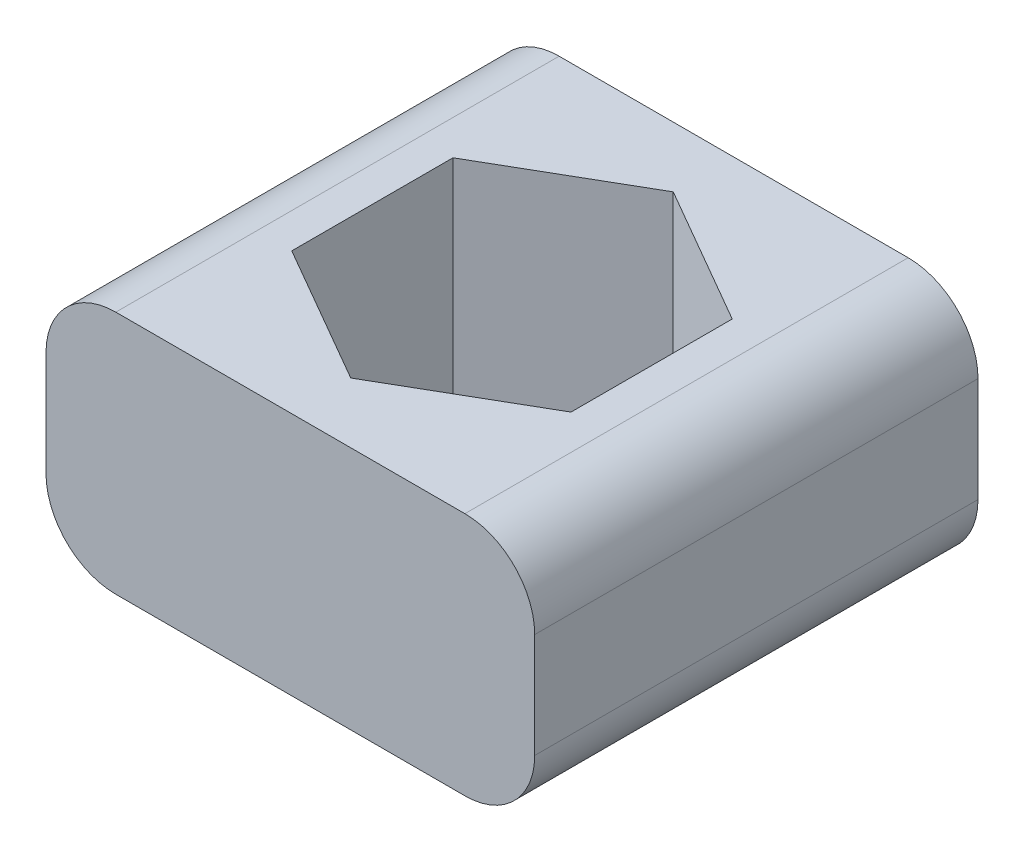
ISO-10303-21;
HEADER;
FILE_DESCRIPTION(('STEP AP214'),'2;1');
FILE_NAME('part.step','',(''),(''),'','','');
FILE_SCHEMA(('AUTOMOTIVE_DESIGN { 1 0 10303 214 1 1 1 1 }'));
ENDSEC;
DATA;
#1=APPLICATION_CONTEXT('core data for automotive mechanical design processes');
#2=APPLICATION_PROTOCOL_DEFINITION('international standard','automotive_design',2000,#1);
#3=PRODUCT_CONTEXT('',#1,'mechanical');
#4=PRODUCT('Part','Part','',(#3));
#5=PRODUCT_RELATED_PRODUCT_CATEGORY('part','',(#4));
#6=PRODUCT_DEFINITION_FORMATION('','',#4);
#7=PRODUCT_DEFINITION_CONTEXT('part definition',#1,'design');
#8=PRODUCT_DEFINITION('design','',#6,#7);
#9=PRODUCT_DEFINITION_SHAPE('','',#8);
#10=(LENGTH_UNIT() NAMED_UNIT(*) SI_UNIT(.MILLI.,.METRE.));
#11=(NAMED_UNIT(*) PLANE_ANGLE_UNIT() SI_UNIT($,.RADIAN.));
#12=(NAMED_UNIT(*) SI_UNIT($,.STERADIAN.) SOLID_ANGLE_UNIT());
#13=UNCERTAINTY_MEASURE_WITH_UNIT(LENGTH_MEASURE(1.E-05),#10,'distance_accuracy_value','');
#14=(GEOMETRIC_REPRESENTATION_CONTEXT(3) GLOBAL_UNCERTAINTY_ASSIGNED_CONTEXT((#13)) GLOBAL_UNIT_ASSIGNED_CONTEXT((#10,
#11,#12)) REPRESENTATION_CONTEXT('',''));
#15=CARTESIAN_POINT('',(0.,0.,0.));
#16=DIRECTION('',(0.,0.,1.));
#17=DIRECTION('',(1.,0.,0.));
#18=AXIS2_PLACEMENT_3D('',#15,#16,#17);
#19=CARTESIAN_POINT('',(7.,-7.,6.35));
#20=DIRECTION('',(-1.,0.,0.));
#21=DIRECTION('',(0.,-1.,0.));
#22=AXIS2_PLACEMENT_3D('',#19,#20,#21);
#23=PLANE('',#22);
#24=DIRECTION('',(0.,1.,0.));
#25=VECTOR('',#24,1.);
#26=CARTESIAN_POINT('',(7.,-7.,-6.35));
#27=LINE('',#26,#25);
#28=CARTESIAN_POINT('',(7.,-5.,-6.35));
#29=VERTEX_POINT('',#28);
#30=CARTESIAN_POINT('',(7.,-2.,-6.35));
#31=VERTEX_POINT('',#30);
#32=EDGE_CURVE('E213',#29,#31,#27,.T.);
#33=ORIENTED_EDGE('',*,*,#32,.T.);
#34=DIRECTION('',(0.,0.,-1.));
#35=VECTOR('',#34,1.);
#36=CARTESIAN_POINT('',(7.,-2.,6.35));
#37=LINE('',#36,#35);
#38=CARTESIAN_POINT('',(7.,-2.,6.35));
#39=VERTEX_POINT('',#38);
#40=EDGE_CURVE('E276',#31,#39,#37,.F.);
#41=ORIENTED_EDGE('',*,*,#40,.T.);
#42=DIRECTION('',(0.,1.,0.));
#43=VECTOR('',#42,1.);
#44=CARTESIAN_POINT('',(7.,-7.,6.35));
#45=LINE('',#44,#43);
#46=CARTESIAN_POINT('',(7.,-5.,6.35));
#47=VERTEX_POINT('',#46);
#48=EDGE_CURVE('E225',#47,#39,#45,.T.);
#49=ORIENTED_EDGE('',*,*,#48,.F.);
#50=DIRECTION('',(0.,0.,-1.));
#51=VECTOR('',#50,1.);
#52=CARTESIAN_POINT('',(7.,-5.,6.35));
#53=LINE('',#52,#51);
#54=EDGE_CURVE('E272',#47,#29,#53,.T.);
#55=ORIENTED_EDGE('',*,*,#54,.T.);
#56=EDGE_LOOP('',(#33,#41,#49,#55));
#57=FACE_BOUND('',#56,.T.);
#58=ADVANCED_FACE('F42',(#57),#23,.F.);
#59=CARTESIAN_POINT('',(-7.,0.,6.35));
#60=DIRECTION('',(0.,-1.,0.));
#61=DIRECTION('',(0.,0.,-1.));
#62=AXIS2_PLACEMENT_3D('',#59,#60,#61);
#63=PLANE('',#62);
#64=DIRECTION('',(0.866025403784439,0.,-0.499999999999999));
#65=VECTOR('',#64,1.);
#66=CARTESIAN_POINT('',(0.,0.,4.61880215351701));
#67=LINE('',#66,#65);
#68=CARTESIAN_POINT('',(0.,0.,4.61880215351701));
#69=VERTEX_POINT('',#68);
#70=CARTESIAN_POINT('',(4.,0.,2.30940107675851));
#71=VERTEX_POINT('',#70);
#72=EDGE_CURVE('E196',#69,#71,#67,.T.);
#73=ORIENTED_EDGE('',*,*,#72,.F.);
#74=DIRECTION('',(0.866025403784438,0.,0.5));
#75=VECTOR('',#74,1.);
#76=CARTESIAN_POINT('',(-4.,0.,2.3094010767585));
#77=LINE('',#76,#75);
#78=CARTESIAN_POINT('',(-4.,0.,2.3094010767585));
#79=VERTEX_POINT('',#78);
#80=EDGE_CURVE('E153',#79,#69,#77,.T.);
#81=ORIENTED_EDGE('',*,*,#80,.F.);
#82=DIRECTION('',(0.,0.,1.));
#83=VECTOR('',#82,1.);
#84=CARTESIAN_POINT('',(-4.,0.,-2.30940107675851));
#85=LINE('',#84,#83);
#86=CARTESIAN_POINT('',(-4.,0.,-2.30940107675851));
#87=VERTEX_POINT('',#86);
#88=EDGE_CURVE('E174',#87,#79,#85,.T.);
#89=ORIENTED_EDGE('',*,*,#88,.F.);
#90=DIRECTION('',(-0.866025403784439,0.,0.5));
#91=VECTOR('',#90,1.);
#92=CARTESIAN_POINT('',(0.,0.,-4.61880215351701));
#93=LINE('',#92,#91);
#94=CARTESIAN_POINT('',(0.,0.,-4.61880215351701));
#95=VERTEX_POINT('',#94);
#96=EDGE_CURVE('E178',#95,#87,#93,.T.);
#97=ORIENTED_EDGE('',*,*,#96,.F.);
#98=DIRECTION('',(-0.866025403784438,0.,-0.500000000000001));
#99=VECTOR('',#98,1.);
#100=CARTESIAN_POINT('',(4.,0.,-2.3094010767585));
#101=LINE('',#100,#99);
#102=CARTESIAN_POINT('',(4.,0.,-2.3094010767585));
#103=VERTEX_POINT('',#102);
#104=EDGE_CURVE('E203',#103,#95,#101,.T.);
#105=ORIENTED_EDGE('',*,*,#104,.F.);
#106=DIRECTION('',(0.,0.,-1.));
#107=VECTOR('',#106,1.);
#108=CARTESIAN_POINT('',(4.,0.,2.30940107675851));
#109=LINE('',#108,#107);
#110=EDGE_CURVE('E199',#71,#103,#109,.T.);
#111=ORIENTED_EDGE('',*,*,#110,.F.);
#112=EDGE_LOOP('',(#73,#81,#89,#97,#105,#111));
#113=FACE_BOUND('',#112,.T.);
#114=DIRECTION('',(-1.,0.,0.));
#115=VECTOR('',#114,1.);
#116=CARTESIAN_POINT('',(-7.,0.,6.35));
#117=LINE('',#116,#115);
#118=CARTESIAN_POINT('',(5.,0.,6.35));
#119=VERTEX_POINT('',#118);
#120=CARTESIAN_POINT('',(-5.,0.,6.35));
#121=VERTEX_POINT('',#120);
#122=EDGE_CURVE('E229',#119,#121,#117,.T.);
#123=ORIENTED_EDGE('',*,*,#122,.F.);
#124=DIRECTION('',(0.,0.,-1.));
#125=VECTOR('',#124,1.);
#126=CARTESIAN_POINT('',(5.,0.,6.35));
#127=LINE('',#126,#125);
#128=CARTESIAN_POINT('',(5.,0.,-6.35));
#129=VERTEX_POINT('',#128);
#130=EDGE_CURVE('E256',#119,#129,#127,.T.);
#131=ORIENTED_EDGE('',*,*,#130,.T.);
#132=DIRECTION('',(-1.,0.,0.));
#133=VECTOR('',#132,1.);
#134=CARTESIAN_POINT('',(-7.,0.,-6.35));
#135=LINE('',#134,#133);
#136=CARTESIAN_POINT('',(-5.,0.,-6.35));
#137=VERTEX_POINT('',#136);
#138=EDGE_CURVE('E244',#129,#137,#135,.T.);
#139=ORIENTED_EDGE('',*,*,#138,.T.);
#140=DIRECTION('',(0.,0.,-1.));
#141=VECTOR('',#140,1.);
#142=CARTESIAN_POINT('',(-5.,0.,6.35));
#143=LINE('',#142,#141);
#144=EDGE_CURVE('E240',#137,#121,#143,.F.);
#145=ORIENTED_EDGE('',*,*,#144,.T.);
#146=EDGE_LOOP('',(#123,#131,#139,#145));
#147=FACE_BOUND('',#146,.T.);
#148=ADVANCED_FACE('F329',(#113,#147),#63,.F.);
#149=CARTESIAN_POINT('',(-7.,0.,6.35));
#150=DIRECTION('',(1.,0.,0.));
#151=DIRECTION('',(0.,1.,0.));
#152=AXIS2_PLACEMENT_3D('',#149,#150,#151);
#153=PLANE('',#152);
#154=DIRECTION('',(0.,-1.,0.));
#155=VECTOR('',#154,1.);
#156=CARTESIAN_POINT('',(-7.,0.,-6.35));
#157=LINE('',#156,#155);
#158=CARTESIAN_POINT('',(-7.,-2.,-6.35));
#159=VERTEX_POINT('',#158);
#160=CARTESIAN_POINT('',(-7.,-5.,-6.35));
#161=VERTEX_POINT('',#160);
#162=EDGE_CURVE('E248',#159,#161,#157,.T.);
#163=ORIENTED_EDGE('',*,*,#162,.T.);
#164=DIRECTION('',(0.,0.,-1.));
#165=VECTOR('',#164,1.);
#166=CARTESIAN_POINT('',(-7.,-5.,6.35));
#167=LINE('',#166,#165);
#168=CARTESIAN_POINT('',(-7.,-5.,6.35));
#169=VERTEX_POINT('',#168);
#170=EDGE_CURVE('E11',#161,#169,#167,.F.);
#171=ORIENTED_EDGE('',*,*,#170,.T.);
#172=DIRECTION('',(0.,-1.,0.));
#173=VECTOR('',#172,1.);
#174=CARTESIAN_POINT('',(-7.,0.,6.35));
#175=LINE('',#174,#173);
#176=CARTESIAN_POINT('',(-7.,-2.,6.35));
#177=VERTEX_POINT('',#176);
#178=EDGE_CURVE('E234',#177,#169,#175,.T.);
#179=ORIENTED_EDGE('',*,*,#178,.F.);
#180=DIRECTION('',(0.,0.,-1.));
#181=VECTOR('',#180,1.);
#182=CARTESIAN_POINT('',(-7.,-2.,6.35));
#183=LINE('',#182,#181);
#184=EDGE_CURVE('E52',#177,#159,#183,.T.);
#185=ORIENTED_EDGE('',*,*,#184,.T.);
#186=EDGE_LOOP('',(#163,#171,#179,#185));
#187=FACE_BOUND('',#186,.T.);
#188=ADVANCED_FACE('F302',(#187),#153,.F.);
#189=CARTESIAN_POINT('',(-7.,-7.,6.35));
#190=DIRECTION('',(0.,1.,0.));
#191=DIRECTION('',(0.,0.,1.));
#192=AXIS2_PLACEMENT_3D('',#189,#190,#191);
#193=PLANE('',#192);
#194=CARTESIAN_POINT('',(0.,-7.,0.));
#195=DIRECTION('',(0.,-1.,0.));
#196=DIRECTION('',(0.,0.,-1.));
#197=AXIS2_PLACEMENT_3D('',#194,#195,#196);
#198=CIRCLE('',#197,2.65);
#199=CARTESIAN_POINT('',(0.,-7.,-2.65));
#200=VERTEX_POINT('',#199);
#201=EDGE_CURVE('E181',#200,#200,#198,.T.);
#202=ORIENTED_EDGE('',*,*,#201,.F.);
#203=EDGE_LOOP('',(#202));
#204=FACE_BOUND('',#203,.T.);
#205=DIRECTION('',(1.,0.,0.));
#206=VECTOR('',#205,1.);
#207=CARTESIAN_POINT('',(-7.,-7.,-6.35));
#208=LINE('',#207,#206);
#209=CARTESIAN_POINT('',(-5.,-7.,-6.35));
#210=VERTEX_POINT('',#209);
#211=CARTESIAN_POINT('',(5.,-7.,-6.35));
#212=VERTEX_POINT('',#211);
#213=EDGE_CURVE('E230',#210,#212,#208,.T.);
#214=ORIENTED_EDGE('',*,*,#213,.T.);
#215=DIRECTION('',(0.,0.,-1.));
#216=VECTOR('',#215,1.);
#217=CARTESIAN_POINT('',(5.,-7.,6.35));
#218=LINE('',#217,#216);
#219=CARTESIAN_POINT('',(5.,-7.,6.35));
#220=VERTEX_POINT('',#219);
#221=EDGE_CURVE('E59',#212,#220,#218,.F.);
#222=ORIENTED_EDGE('',*,*,#221,.T.);
#223=DIRECTION('',(1.,0.,0.));
#224=VECTOR('',#223,1.);
#225=CARTESIAN_POINT('',(-7.,-7.,6.35));
#226=LINE('',#225,#224);
#227=CARTESIAN_POINT('',(-5.,-7.,6.35));
#228=VERTEX_POINT('',#227);
#229=EDGE_CURVE('E237',#228,#220,#226,.T.);
#230=ORIENTED_EDGE('',*,*,#229,.F.);
#231=DIRECTION('',(0.,0.,-1.));
#232=VECTOR('',#231,1.);
#233=CARTESIAN_POINT('',(-5.,-7.,6.35));
#234=LINE('',#233,#232);
#235=EDGE_CURVE('E290',#228,#210,#234,.T.);
#236=ORIENTED_EDGE('',*,*,#235,.T.);
#237=EDGE_LOOP('',(#214,#222,#230,#236));
#238=FACE_BOUND('',#237,.T.);
#239=ADVANCED_FACE('F313',(#204,#238),#193,.F.);
#240=CARTESIAN_POINT('',(0.,0.,6.35));
#241=DIRECTION('',(0.,0.,-1.));
#242=DIRECTION('',(-1.,0.,0.));
#243=AXIS2_PLACEMENT_3D('',#240,#241,#242);
#244=PLANE('',#243);
#245=ORIENTED_EDGE('',*,*,#48,.T.);
#246=CARTESIAN_POINT('',(5.,-2.,6.35));
#247=DIRECTION('',(0.,0.,-1.));
#248=DIRECTION('',(-1.,0.,0.));
#249=AXIS2_PLACEMENT_3D('',#246,#247,#248);
#250=CIRCLE('',#249,2.);
#251=EDGE_CURVE('E287',#39,#119,#250,.F.);
#252=ORIENTED_EDGE('',*,*,#251,.T.);
#253=ORIENTED_EDGE('',*,*,#122,.T.);
#254=CARTESIAN_POINT('',(-5.,-2.,6.35));
#255=DIRECTION('',(0.,0.,-1.));
#256=DIRECTION('',(-1.,0.,0.));
#257=AXIS2_PLACEMENT_3D('',#254,#255,#256);
#258=CIRCLE('',#257,2.);
#259=EDGE_CURVE('E279',#121,#177,#258,.F.);
#260=ORIENTED_EDGE('',*,*,#259,.T.);
#261=ORIENTED_EDGE('',*,*,#178,.T.);
#262=CARTESIAN_POINT('',(-5.,-5.,6.35));
#263=DIRECTION('',(0.,0.,-1.));
#264=DIRECTION('',(-1.,0.,0.));
#265=AXIS2_PLACEMENT_3D('',#262,#263,#264);
#266=CIRCLE('',#265,2.);
#267=EDGE_CURVE('E66',#169,#228,#266,.F.);
#268=ORIENTED_EDGE('',*,*,#267,.T.);
#269=ORIENTED_EDGE('',*,*,#229,.T.);
#270=CARTESIAN_POINT('',(5.,-5.,6.35));
#271=DIRECTION('',(0.,0.,-1.));
#272=DIRECTION('',(-1.,0.,0.));
#273=AXIS2_PLACEMENT_3D('',#270,#271,#272);
#274=CIRCLE('',#273,2.);
#275=EDGE_CURVE('E284',#220,#47,#274,.F.);
#276=ORIENTED_EDGE('',*,*,#275,.T.);
#277=EDGE_LOOP('',(#245,#252,#253,#260,#261,#268,#269,#276));
#278=FACE_BOUND('',#277,.T.);
#279=ADVANCED_FACE('F315',(#278),#244,.F.);
#280=CARTESIAN_POINT('',(0.,0.,-6.35));
#281=DIRECTION('',(0.,0.,-1.));
#282=DIRECTION('',(-1.,0.,0.));
#283=AXIS2_PLACEMENT_3D('',#280,#281,#282);
#284=PLANE('',#283);
#285=ORIENTED_EDGE('',*,*,#138,.F.);
#286=CARTESIAN_POINT('',(5.,-2.,-6.35));
#287=DIRECTION('',(0.,0.,-1.));
#288=DIRECTION('',(-1.,0.,0.));
#289=AXIS2_PLACEMENT_3D('',#286,#287,#288);
#290=CIRCLE('',#289,2.);
#291=EDGE_CURVE('E269',#129,#31,#290,.T.);
#292=ORIENTED_EDGE('',*,*,#291,.T.);
#293=ORIENTED_EDGE('',*,*,#32,.F.);
#294=CARTESIAN_POINT('',(5.,-5.,-6.35));
#295=DIRECTION('',(0.,0.,-1.));
#296=DIRECTION('',(-1.,0.,0.));
#297=AXIS2_PLACEMENT_3D('',#294,#295,#296);
#298=CIRCLE('',#297,2.);
#299=EDGE_CURVE('E266',#29,#212,#298,.T.);
#300=ORIENTED_EDGE('',*,*,#299,.T.);
#301=ORIENTED_EDGE('',*,*,#213,.F.);
#302=CARTESIAN_POINT('',(-5.,-5.,-6.35));
#303=DIRECTION('',(0.,0.,-1.));
#304=DIRECTION('',(-1.,0.,0.));
#305=AXIS2_PLACEMENT_3D('',#302,#303,#304);
#306=CIRCLE('',#305,2.);
#307=EDGE_CURVE('E263',#210,#161,#306,.T.);
#308=ORIENTED_EDGE('',*,*,#307,.T.);
#309=ORIENTED_EDGE('',*,*,#162,.F.);
#310=CARTESIAN_POINT('',(-5.,-2.,-6.35));
#311=DIRECTION('',(0.,0.,-1.));
#312=DIRECTION('',(-1.,0.,0.));
#313=AXIS2_PLACEMENT_3D('',#310,#311,#312);
#314=CIRCLE('',#313,2.);
#315=EDGE_CURVE('E260',#159,#137,#314,.T.);
#316=ORIENTED_EDGE('',*,*,#315,.T.);
#317=EDGE_LOOP('',(#285,#292,#293,#300,#301,#308,#309,#316));
#318=FACE_BOUND('',#317,.T.);
#319=ADVANCED_FACE('F308',(#318),#284,.T.);
#320=CARTESIAN_POINT('',(-4.,-6.,2.3094010767585));
#321=DIRECTION('',(-0.5,0.,0.866025403784438));
#322=DIRECTION('',(0.866025403784439,0.,0.5));
#323=AXIS2_PLACEMENT_3D('',#320,#321,#322);
#324=PLANE('',#323);
#325=ORIENTED_EDGE('',*,*,#80,.T.);
#326=DIRECTION('',(0.,1.,0.));
#327=VECTOR('',#326,1.);
#328=CARTESIAN_POINT('',(0.,-6.,4.61880215351701));
#329=LINE('',#328,#327);
#330=CARTESIAN_POINT('',(0.,-6.,4.61880215351701));
#331=VERTEX_POINT('',#330);
#332=EDGE_CURVE('E146',#331,#69,#329,.T.);
#333=ORIENTED_EDGE('',*,*,#332,.F.);
#334=DIRECTION('',(0.866025403784438,0.,0.5));
#335=VECTOR('',#334,1.);
#336=CARTESIAN_POINT('',(-4.,-6.,2.3094010767585));
#337=LINE('',#336,#335);
#338=CARTESIAN_POINT('',(-4.,-6.,2.3094010767585));
#339=VERTEX_POINT('',#338);
#340=EDGE_CURVE('E150',#339,#331,#337,.T.);
#341=ORIENTED_EDGE('',*,*,#340,.F.);
#342=DIRECTION('',(0.,1.,0.));
#343=VECTOR('',#342,1.);
#344=CARTESIAN_POINT('',(-4.,-6.,2.3094010767585));
#345=LINE('',#344,#343);
#346=EDGE_CURVE('E210',#339,#79,#345,.T.);
#347=ORIENTED_EDGE('',*,*,#346,.T.);
#348=EDGE_LOOP('',(#325,#333,#341,#347));
#349=FACE_BOUND('',#348,.T.);
#350=ADVANCED_FACE('F148',(#349),#324,.F.);
#351=CARTESIAN_POINT('',(-4.,-6.,-2.30940107675851));
#352=DIRECTION('',(-1.,0.,0.));
#353=DIRECTION('',(0.,0.,1.));
#354=AXIS2_PLACEMENT_3D('',#351,#352,#353);
#355=PLANE('',#354);
#356=ORIENTED_EDGE('',*,*,#88,.T.);
#357=ORIENTED_EDGE('',*,*,#346,.F.);
#358=DIRECTION('',(0.,0.,1.));
#359=VECTOR('',#358,1.);
#360=CARTESIAN_POINT('',(-4.,-6.,-2.30940107675851));
#361=LINE('',#360,#359);
#362=CARTESIAN_POINT('',(-4.,-6.,-2.30940107675851));
#363=VERTEX_POINT('',#362);
#364=EDGE_CURVE('E159',#363,#339,#361,.T.);
#365=ORIENTED_EDGE('',*,*,#364,.F.);
#366=DIRECTION('',(0.,1.,0.));
#367=VECTOR('',#366,1.);
#368=CARTESIAN_POINT('',(-4.,-6.,-2.30940107675851));
#369=LINE('',#368,#367);
#370=EDGE_CURVE('E214',#363,#87,#369,.T.);
#371=ORIENTED_EDGE('',*,*,#370,.T.);
#372=EDGE_LOOP('',(#356,#357,#365,#371));
#373=FACE_BOUND('',#372,.T.);
#374=ADVANCED_FACE('F442',(#373),#355,.F.);
#375=CARTESIAN_POINT('',(0.,-6.,-4.61880215351701));
#376=DIRECTION('',(-0.5,0.,-0.866025403784439));
#377=DIRECTION('',(-0.866025403784439,0.,0.5));
#378=AXIS2_PLACEMENT_3D('',#375,#376,#377);
#379=PLANE('',#378);
#380=ORIENTED_EDGE('',*,*,#96,.T.);
#381=ORIENTED_EDGE('',*,*,#370,.F.);
#382=DIRECTION('',(-0.866025403784439,0.,0.5));
#383=VECTOR('',#382,1.);
#384=CARTESIAN_POINT('',(0.,-6.,-4.61880215351701));
#385=LINE('',#384,#383);
#386=CARTESIAN_POINT('',(0.,-6.,-4.61880215351701));
#387=VERTEX_POINT('',#386);
#388=EDGE_CURVE('E189',#387,#363,#385,.T.);
#389=ORIENTED_EDGE('',*,*,#388,.F.);
#390=DIRECTION('',(0.,1.,0.));
#391=VECTOR('',#390,1.);
#392=CARTESIAN_POINT('',(0.,-6.,-4.61880215351701));
#393=LINE('',#392,#391);
#394=EDGE_CURVE('E217',#387,#95,#393,.T.);
#395=ORIENTED_EDGE('',*,*,#394,.T.);
#396=EDGE_LOOP('',(#380,#381,#389,#395));
#397=FACE_BOUND('',#396,.T.);
#398=ADVANCED_FACE('F432',(#397),#379,.F.);
#399=CARTESIAN_POINT('',(4.,-6.,-2.3094010767585));
#400=DIRECTION('',(0.500000000000001,0.,-0.866025403784438));
#401=DIRECTION('',(-0.866025403784438,0.,-0.500000000000001));
#402=AXIS2_PLACEMENT_3D('',#399,#400,#401);
#403=PLANE('',#402);
#404=ORIENTED_EDGE('',*,*,#104,.T.);
#405=ORIENTED_EDGE('',*,*,#394,.F.);
#406=DIRECTION('',(-0.866025403784438,0.,-0.500000000000001));
#407=VECTOR('',#406,1.);
#408=CARTESIAN_POINT('',(4.,-6.,-2.3094010767585));
#409=LINE('',#408,#407);
#410=CARTESIAN_POINT('',(4.,-6.,-2.3094010767585));
#411=VERTEX_POINT('',#410);
#412=EDGE_CURVE('E185',#411,#387,#409,.T.);
#413=ORIENTED_EDGE('',*,*,#412,.F.);
#414=DIRECTION('',(0.,1.,0.));
#415=VECTOR('',#414,1.);
#416=CARTESIAN_POINT('',(4.,-6.,-2.3094010767585));
#417=LINE('',#416,#415);
#418=EDGE_CURVE('E220',#411,#103,#417,.T.);
#419=ORIENTED_EDGE('',*,*,#418,.T.);
#420=EDGE_LOOP('',(#404,#405,#413,#419));
#421=FACE_BOUND('',#420,.T.);
#422=ADVANCED_FACE('F422',(#421),#403,.F.);
#423=CARTESIAN_POINT('',(4.,-6.,2.30940107675851));
#424=DIRECTION('',(1.,0.,0.));
#425=DIRECTION('',(0.,0.,-1.));
#426=AXIS2_PLACEMENT_3D('',#423,#424,#425);
#427=PLANE('',#426);
#428=ORIENTED_EDGE('',*,*,#110,.T.);
#429=ORIENTED_EDGE('',*,*,#418,.F.);
#430=DIRECTION('',(0.,0.,-1.));
#431=VECTOR('',#430,1.);
#432=CARTESIAN_POINT('',(4.,-6.,2.30940107675851));
#433=LINE('',#432,#431);
#434=CARTESIAN_POINT('',(4.,-6.,2.30940107675851));
#435=VERTEX_POINT('',#434);
#436=EDGE_CURVE('E168',#435,#411,#433,.T.);
#437=ORIENTED_EDGE('',*,*,#436,.F.);
#438=DIRECTION('',(0.,1.,0.));
#439=VECTOR('',#438,1.);
#440=CARTESIAN_POINT('',(4.,-6.,2.30940107675851));
#441=LINE('',#440,#439);
#442=EDGE_CURVE('E158',#435,#71,#441,.T.);
#443=ORIENTED_EDGE('',*,*,#442,.T.);
#444=EDGE_LOOP('',(#428,#429,#437,#443));
#445=FACE_BOUND('',#444,.T.);
#446=ADVANCED_FACE('F413',(#445),#427,.F.);
#447=CARTESIAN_POINT('',(0.,-6.,4.61880215351701));
#448=DIRECTION('',(0.499999999999999,0.,0.866025403784439));
#449=DIRECTION('',(0.866025403784439,0.,-0.499999999999999));
#450=AXIS2_PLACEMENT_3D('',#447,#448,#449);
#451=PLANE('',#450);
#452=ORIENTED_EDGE('',*,*,#72,.T.);
#453=ORIENTED_EDGE('',*,*,#442,.F.);
#454=DIRECTION('',(0.866025403784439,0.,-0.499999999999999));
#455=VECTOR('',#454,1.);
#456=CARTESIAN_POINT('',(0.,-6.,4.61880215351701));
#457=LINE('',#456,#455);
#458=EDGE_CURVE('E162',#331,#435,#457,.T.);
#459=ORIENTED_EDGE('',*,*,#458,.F.);
#460=ORIENTED_EDGE('',*,*,#332,.T.);
#461=EDGE_LOOP('',(#452,#453,#459,#460));
#462=FACE_BOUND('',#461,.T.);
#463=ADVANCED_FACE('F163',(#462),#451,.F.);
#464=CARTESIAN_POINT('',(0.,-6.,0.));
#465=DIRECTION('',(0.,1.,0.));
#466=DIRECTION('',(0.,0.,1.));
#467=AXIS2_PLACEMENT_3D('',#464,#465,#466);
#468=PLANE('',#467);
#469=CARTESIAN_POINT('',(0.,-6.,0.));
#470=DIRECTION('',(0.,1.,0.));
#471=DIRECTION('',(0.,0.,1.));
#472=AXIS2_PLACEMENT_3D('',#469,#470,#471);
#473=CIRCLE('',#472,2.65);
#474=CARTESIAN_POINT('',(0.,-6.,2.65));
#475=VERTEX_POINT('',#474);
#476=EDGE_CURVE('E46',#475,#475,#473,.T.);
#477=ORIENTED_EDGE('',*,*,#476,.F.);
#478=EDGE_LOOP('',(#477));
#479=FACE_BOUND('',#478,.T.);
#480=ORIENTED_EDGE('',*,*,#340,.T.);
#481=ORIENTED_EDGE('',*,*,#458,.T.);
#482=ORIENTED_EDGE('',*,*,#436,.T.);
#483=ORIENTED_EDGE('',*,*,#412,.T.);
#484=ORIENTED_EDGE('',*,*,#388,.T.);
#485=ORIENTED_EDGE('',*,*,#364,.T.);
#486=EDGE_LOOP('',(#480,#481,#482,#483,#484,#485));
#487=FACE_BOUND('',#486,.T.);
#488=ADVANCED_FACE('F170',(#479,#487),#468,.T.);
#489=CARTESIAN_POINT('',(5.,-2.,6.35));
#490=DIRECTION('',(0.,0.,-1.));
#491=DIRECTION('',(-1.,0.,0.));
#492=AXIS2_PLACEMENT_3D('',#489,#490,#491);
#493=CYLINDRICAL_SURFACE('',#492,2.);
#494=ORIENTED_EDGE('',*,*,#251,.F.);
#495=ORIENTED_EDGE('',*,*,#40,.F.);
#496=ORIENTED_EDGE('',*,*,#291,.F.);
#497=ORIENTED_EDGE('',*,*,#130,.F.);
#498=EDGE_LOOP('',(#494,#495,#496,#497));
#499=FACE_BOUND('',#498,.T.);
#500=ADVANCED_FACE('F326',(#499),#493,.T.);
#501=CARTESIAN_POINT('',(5.,-5.,6.35));
#502=DIRECTION('',(0.,0.,-1.));
#503=DIRECTION('',(-1.,0.,0.));
#504=AXIS2_PLACEMENT_3D('',#501,#502,#503);
#505=CYLINDRICAL_SURFACE('',#504,2.);
#506=ORIENTED_EDGE('',*,*,#275,.F.);
#507=ORIENTED_EDGE('',*,*,#221,.F.);
#508=ORIENTED_EDGE('',*,*,#299,.F.);
#509=ORIENTED_EDGE('',*,*,#54,.F.);
#510=EDGE_LOOP('',(#506,#507,#508,#509));
#511=FACE_BOUND('',#510,.T.);
#512=ADVANCED_FACE('F319',(#511),#505,.T.);
#513=CARTESIAN_POINT('',(-5.,-5.,6.35));
#514=DIRECTION('',(0.,0.,-1.));
#515=DIRECTION('',(-1.,0.,0.));
#516=AXIS2_PLACEMENT_3D('',#513,#514,#515);
#517=CYLINDRICAL_SURFACE('',#516,2.);
#518=ORIENTED_EDGE('',*,*,#267,.F.);
#519=ORIENTED_EDGE('',*,*,#170,.F.);
#520=ORIENTED_EDGE('',*,*,#307,.F.);
#521=ORIENTED_EDGE('',*,*,#235,.F.);
#522=EDGE_LOOP('',(#518,#519,#520,#521));
#523=FACE_BOUND('',#522,.T.);
#524=ADVANCED_FACE('F312',(#523),#517,.T.);
#525=CARTESIAN_POINT('',(-5.,-2.,6.35));
#526=DIRECTION('',(0.,0.,-1.));
#527=DIRECTION('',(-1.,0.,0.));
#528=AXIS2_PLACEMENT_3D('',#525,#526,#527);
#529=CYLINDRICAL_SURFACE('',#528,2.);
#530=ORIENTED_EDGE('',*,*,#259,.F.);
#531=ORIENTED_EDGE('',*,*,#144,.F.);
#532=ORIENTED_EDGE('',*,*,#315,.F.);
#533=ORIENTED_EDGE('',*,*,#184,.F.);
#534=EDGE_LOOP('',(#530,#531,#532,#533));
#535=FACE_BOUND('',#534,.T.);
#536=ADVANCED_FACE('F44',(#535),#529,.T.);
#537=CARTESIAN_POINT('',(0.,-7.,0.));
#538=DIRECTION('',(0.,-1.,0.));
#539=DIRECTION('',(0.,0.,-1.));
#540=AXIS2_PLACEMENT_3D('',#537,#538,#539);
#541=CYLINDRICAL_SURFACE('',#540,2.65);
#542=ORIENTED_EDGE('',*,*,#476,.T.);
#543=EDGE_LOOP('',(#542));
#544=FACE_BOUND('',#543,.T.);
#545=ORIENTED_EDGE('',*,*,#201,.T.);
#546=EDGE_LOOP('',(#545));
#547=FACE_BOUND('',#546,.T.);
#548=ADVANCED_FACE('F332',(#544,#547),#541,.F.);
#549=CLOSED_SHELL('',(#58,#148,#188,#239,#279,#319,#350,#374,#398,#422,#446,#463,#488,#500,#512,
#524,#536,#548));
#550=MANIFOLD_SOLID_BREP('B2',#549);
#551=ADVANCED_BREP_SHAPE_REPRESENTATION('',(#18,#550),#14);
#552=SHAPE_DEFINITION_REPRESENTATION(#9,#551);
ENDSEC;
END-ISO-10303-21;
